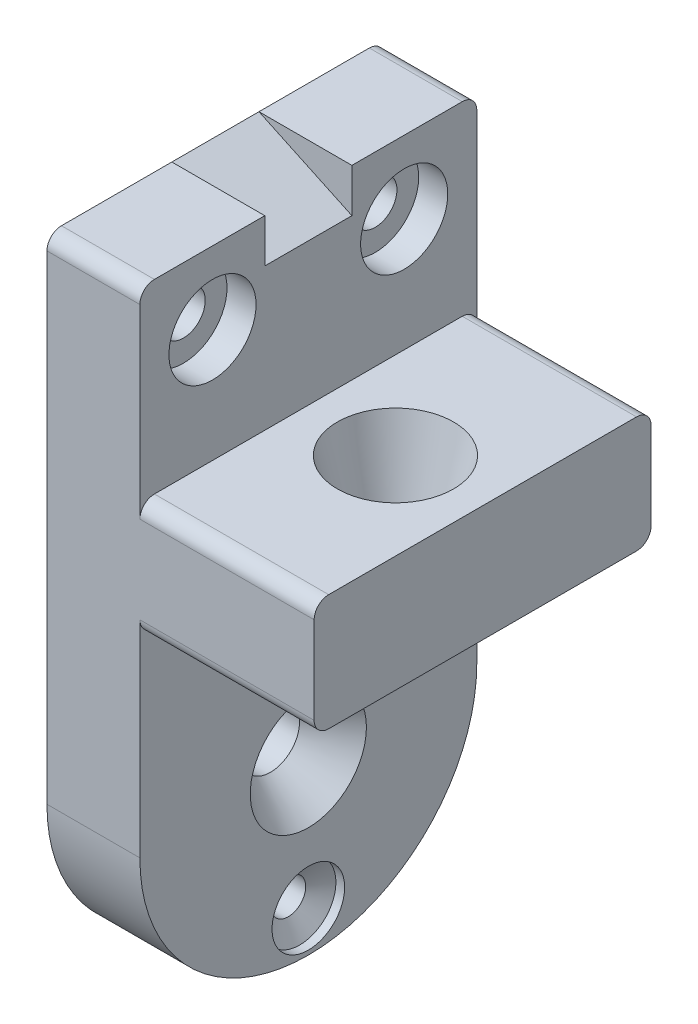
ISO-10303-21;
HEADER;
FILE_DESCRIPTION(('STEP AP214'),'2;1');
FILE_NAME('part.step','',(''),(''),'','','');
FILE_SCHEMA(('AUTOMOTIVE_DESIGN { 1 0 10303 214 1 1 1 1 }'));
ENDSEC;
DATA;
#1=APPLICATION_CONTEXT('core data for automotive mechanical design processes');
#2=APPLICATION_PROTOCOL_DEFINITION('international standard','automotive_design',2000,#1);
#3=PRODUCT_CONTEXT('',#1,'mechanical');
#4=PRODUCT('Part','Part','',(#3));
#5=PRODUCT_RELATED_PRODUCT_CATEGORY('part','',(#4));
#6=PRODUCT_DEFINITION_FORMATION('','',#4);
#7=PRODUCT_DEFINITION_CONTEXT('part definition',#1,'design');
#8=PRODUCT_DEFINITION('design','',#6,#7);
#9=PRODUCT_DEFINITION_SHAPE('','',#8);
#10=(LENGTH_UNIT() NAMED_UNIT(*) SI_UNIT(.MILLI.,.METRE.));
#11=(NAMED_UNIT(*) PLANE_ANGLE_UNIT() SI_UNIT($,.RADIAN.));
#12=(NAMED_UNIT(*) SI_UNIT($,.STERADIAN.) SOLID_ANGLE_UNIT());
#13=UNCERTAINTY_MEASURE_WITH_UNIT(LENGTH_MEASURE(1.E-05),#10,'distance_accuracy_value','');
#14=(GEOMETRIC_REPRESENTATION_CONTEXT(3) GLOBAL_UNCERTAINTY_ASSIGNED_CONTEXT((#13)) GLOBAL_UNIT_ASSIGNED_CONTEXT((#10,
#11,#12)) REPRESENTATION_CONTEXT('',''));
#15=CARTESIAN_POINT('',(0.,0.,0.));
#16=DIRECTION('',(0.,0.,1.));
#17=DIRECTION('',(1.,0.,0.));
#18=AXIS2_PLACEMENT_3D('',#15,#16,#17);
#19=CARTESIAN_POINT('',(0.,228.,-116.));
#20=DIRECTION('',(0.,1.,0.));
#21=DIRECTION('',(0.,0.,1.));
#22=AXIS2_PLACEMENT_3D('',#19,#20,#21);
#23=PLANE('',#22);
#24=DIRECTION('',(0.,0.,1.));
#25=VECTOR('',#24,1.);
#26=CARTESIAN_POINT('',(-32.,228.,-116.));
#27=LINE('',#26,#25);
#28=CARTESIAN_POINT('',(-32.,228.,-111.));
#29=VERTEX_POINT('',#28);
#30=CARTESIAN_POINT('',(-32.,228.,-73.));
#31=VERTEX_POINT('',#30);
#32=EDGE_CURVE('E277',#29,#31,#27,.T.);
#33=ORIENTED_EDGE('',*,*,#32,.T.);
#34=DIRECTION('',(-1.,0.,0.));
#35=VECTOR('',#34,1.);
#36=CARTESIAN_POINT('',(-32.,228.,-73.));
#37=LINE('',#36,#35);
#38=CARTESIAN_POINT('',(0.,228.,-73.));
#39=VERTEX_POINT('',#38);
#40=EDGE_CURVE('E184',#39,#31,#37,.T.);
#41=ORIENTED_EDGE('',*,*,#40,.F.);
#42=DIRECTION('',(0.,0.,1.));
#43=VECTOR('',#42,1.);
#44=CARTESIAN_POINT('',(0.,228.,-116.));
#45=LINE('',#44,#43);
#46=CARTESIAN_POINT('',(0.,228.,-111.));
#47=VERTEX_POINT('',#46);
#48=EDGE_CURVE('E195',#47,#39,#45,.T.);
#49=ORIENTED_EDGE('',*,*,#48,.F.);
#50=DIRECTION('',(-1.,0.,0.));
#51=VECTOR('',#50,1.);
#52=CARTESIAN_POINT('',(0.,228.,-111.));
#53=LINE('',#52,#51);
#54=EDGE_CURVE('E331',#47,#29,#53,.T.);
#55=ORIENTED_EDGE('',*,*,#54,.T.);
#56=EDGE_LOOP('',(#33,#41,#49,#55));
#57=FACE_BOUND('',#56,.T.);
#58=ADVANCED_FACE('F45',(#57),#23,.T.);
#59=CARTESIAN_POINT('',(0.,164.,-116.));
#60=DIRECTION('',(1.,0.,0.));
#61=DIRECTION('',(0.,1.,0.));
#62=AXIS2_PLACEMENT_3D('',#59,#60,#61);
#63=PLANE('',#62);
#64=CARTESIAN_POINT('',(0.,203.,-25.));
#65=DIRECTION('',(1.,0.,0.));
#66=DIRECTION('',(0.,0.,-1.));
#67=AXIS2_PLACEMENT_3D('',#64,#65,#66);
#68=CIRCLE('',#67,15.);
#69=CARTESIAN_POINT('',(0.,203.,-40.));
#70=VERTEX_POINT('',#69);
#71=EDGE_CURVE('E231',#70,#70,#68,.T.);
#72=ORIENTED_EDGE('',*,*,#71,.F.);
#73=EDGE_LOOP('',(#72));
#74=FACE_BOUND('',#73,.T.);
#75=CARTESIAN_POINT('',(0.,203.,-91.));
#76=DIRECTION('',(1.,0.,0.));
#77=DIRECTION('',(0.,0.,-1.));
#78=AXIS2_PLACEMENT_3D('',#75,#76,#77);
#79=CIRCLE('',#78,15.);
#80=CARTESIAN_POINT('',(0.,203.,-106.));
#81=VERTEX_POINT('',#80);
#82=EDGE_CURVE('E243',#81,#81,#79,.T.);
#83=ORIENTED_EDGE('',*,*,#82,.F.);
#84=EDGE_LOOP('',(#83));
#85=FACE_BOUND('',#84,.T.);
#86=ORIENTED_EDGE('',*,*,#48,.T.);
#87=DIRECTION('',(0.,1.,0.));
#88=VECTOR('',#87,1.);
#89=CARTESIAN_POINT('',(0.,228.,-73.));
#90=LINE('',#89,#88);
#91=CARTESIAN_POINT('',(0.,213.,-73.));
#92=VERTEX_POINT('',#91);
#93=EDGE_CURVE('E188',#92,#39,#90,.T.);
#94=ORIENTED_EDGE('',*,*,#93,.F.);
#95=DIRECTION('',(0.,0.,1.));
#96=VECTOR('',#95,1.);
#97=CARTESIAN_POINT('',(0.,213.,-73.));
#98=LINE('',#97,#96);
#99=CARTESIAN_POINT('',(0.,213.,-43.));
#100=VERTEX_POINT('',#99);
#101=EDGE_CURVE('E175',#92,#100,#98,.T.);
#102=ORIENTED_EDGE('',*,*,#101,.T.);
#103=DIRECTION('',(0.,1.,0.));
#104=VECTOR('',#103,1.);
#105=CARTESIAN_POINT('',(0.,228.,-43.));
#106=LINE('',#105,#104);
#107=CARTESIAN_POINT('',(0.,228.,-43.));
#108=VERTEX_POINT('',#107);
#109=EDGE_CURVE('E200',#100,#108,#106,.T.);
#110=ORIENTED_EDGE('',*,*,#109,.T.);
#111=CARTESIAN_POINT('',(0.,228.,-5.00000000000003));
#112=VERTEX_POINT('',#111);
#113=EDGE_CURVE('E283',#108,#112,#45,.T.);
#114=ORIENTED_EDGE('',*,*,#113,.T.);
#115=CARTESIAN_POINT('',(0.,223.,-5.));
#116=DIRECTION('',(1.,0.,0.));
#117=DIRECTION('',(0.,1.,0.));
#118=AXIS2_PLACEMENT_3D('',#115,#116,#117);
#119=CIRCLE('',#118,5.);
#120=CARTESIAN_POINT('',(0.,223.,0.));
#121=VERTEX_POINT('',#120);
#122=EDGE_CURVE('E339',#112,#121,#119,.T.);
#123=ORIENTED_EDGE('',*,*,#122,.T.);
#124=DIRECTION('',(0.,1.,0.));
#125=VECTOR('',#124,1.);
#126=CARTESIAN_POINT('',(0.,164.,0.));
#127=LINE('',#126,#125);
#128=CARTESIAN_POINT('',(0.,159.,0.));
#129=VERTEX_POINT('',#128);
#130=EDGE_CURVE('E273',#129,#121,#127,.T.);
#131=ORIENTED_EDGE('',*,*,#130,.F.);
#132=CARTESIAN_POINT('',(0.,159.,-5.));
#133=DIRECTION('',(1.,0.,0.));
#134=DIRECTION('',(0.,1.,0.));
#135=AXIS2_PLACEMENT_3D('',#132,#133,#134);
#136=CIRCLE('',#135,5.);
#137=CARTESIAN_POINT('',(0.,164.,-5.00000000000003));
#138=VERTEX_POINT('',#137);
#139=EDGE_CURVE('E348',#129,#138,#136,.F.);
#140=ORIENTED_EDGE('',*,*,#139,.T.);
#141=DIRECTION('',(0.,0.,1.));
#142=VECTOR('',#141,1.);
#143=CARTESIAN_POINT('',(0.,164.,-116.));
#144=LINE('',#143,#142);
#145=CARTESIAN_POINT('',(0.,164.,-111.));
#146=VERTEX_POINT('',#145);
#147=EDGE_CURVE('E284',#146,#138,#144,.T.);
#148=ORIENTED_EDGE('',*,*,#147,.F.);
#149=CARTESIAN_POINT('',(0.,159.,-111.));
#150=DIRECTION('',(1.,0.,0.));
#151=DIRECTION('',(0.,1.,0.));
#152=AXIS2_PLACEMENT_3D('',#149,#150,#151);
#153=CIRCLE('',#152,5.);
#154=CARTESIAN_POINT('',(0.,159.,-116.));
#155=VERTEX_POINT('',#154);
#156=EDGE_CURVE('E350',#146,#155,#153,.F.);
#157=ORIENTED_EDGE('',*,*,#156,.T.);
#158=DIRECTION('',(0.,1.,0.));
#159=VECTOR('',#158,1.);
#160=CARTESIAN_POINT('',(0.,164.,-116.));
#161=LINE('',#160,#159);
#162=CARTESIAN_POINT('',(0.,223.,-116.));
#163=VERTEX_POINT('',#162);
#164=EDGE_CURVE('E261',#155,#163,#161,.T.);
#165=ORIENTED_EDGE('',*,*,#164,.T.);
#166=CARTESIAN_POINT('',(0.,223.,-111.));
#167=DIRECTION('',(1.,0.,0.));
#168=DIRECTION('',(0.,1.,0.));
#169=AXIS2_PLACEMENT_3D('',#166,#167,#168);
#170=CIRCLE('',#169,5.);
#171=EDGE_CURVE('E341',#163,#47,#170,.T.);
#172=ORIENTED_EDGE('',*,*,#171,.T.);
#173=EDGE_LOOP('',(#86,#94,#102,#110,#114,#123,#131,#140,#148,#157,#165,#172));
#174=FACE_BOUND('',#173,.T.);
#175=ADVANCED_FACE('F193',(#74,#85,#174),#63,.T.);
#176=CARTESIAN_POINT('',(0.,0.,-116.));
#177=DIRECTION('',(1.,0.,0.));
#178=DIRECTION('',(0.,0.,-1.));
#179=AXIS2_PLACEMENT_3D('',#176,#177,#178);
#180=PLANE('',#179);
#181=CARTESIAN_POINT('',(0.,14.,-58.));
#182=DIRECTION('',(1.,0.,0.));
#183=DIRECTION('',(0.,0.,-1.));
#184=AXIS2_PLACEMENT_3D('',#181,#182,#183);
#185=CIRCLE('',#184,12.5);
#186=CARTESIAN_POINT('',(0.,14.,-70.5));
#187=VERTEX_POINT('',#186);
#188=EDGE_CURVE('E210',#187,#187,#185,.T.);
#189=ORIENTED_EDGE('',*,*,#188,.F.);
#190=EDGE_LOOP('',(#189));
#191=FACE_BOUND('',#190,.T.);
#192=CARTESIAN_POINT('',(0.,58.,-58.));
#193=DIRECTION('',(1.,0.,0.));
#194=DIRECTION('',(0.,0.,-1.));
#195=AXIS2_PLACEMENT_3D('',#192,#193,#194);
#196=CIRCLE('',#195,20.);
#197=CARTESIAN_POINT('',(0.,58.,-78.));
#198=VERTEX_POINT('',#197);
#199=EDGE_CURVE('E222',#198,#198,#196,.T.);
#200=ORIENTED_EDGE('',*,*,#199,.F.);
#201=EDGE_LOOP('',(#200));
#202=FACE_BOUND('',#201,.T.);
#203=CARTESIAN_POINT('',(0.,58.,-58.));
#204=DIRECTION('',(1.,0.,0.));
#205=DIRECTION('',(0.,0.,-1.));
#206=AXIS2_PLACEMENT_3D('',#203,#204,#205);
#207=CIRCLE('',#206,58.);
#208=CARTESIAN_POINT('',(0.,58.,0.));
#209=VERTEX_POINT('',#208);
#210=CARTESIAN_POINT('',(0.,0.,-58.));
#211=VERTEX_POINT('',#210);
#212=EDGE_CURVE('E353',#209,#211,#207,.T.);
#213=ORIENTED_EDGE('',*,*,#212,.T.);
#214=CARTESIAN_POINT('',(0.,58.,-58.));
#215=DIRECTION('',(1.,0.,0.));
#216=DIRECTION('',(0.,0.,-1.));
#217=AXIS2_PLACEMENT_3D('',#214,#215,#216);
#218=CIRCLE('',#217,58.);
#219=CARTESIAN_POINT('',(0.,58.,-116.));
#220=VERTEX_POINT('',#219);
#221=EDGE_CURVE('E355',#211,#220,#218,.T.);
#222=ORIENTED_EDGE('',*,*,#221,.T.);
#223=DIRECTION('',(0.,1.,0.));
#224=VECTOR('',#223,1.);
#225=CARTESIAN_POINT('',(0.,0.,-116.));
#226=LINE('',#225,#224);
#227=CARTESIAN_POINT('',(0.,129.,-116.));
#228=VERTEX_POINT('',#227);
#229=EDGE_CURVE('E255',#220,#228,#226,.T.);
#230=ORIENTED_EDGE('',*,*,#229,.T.);
#231=CARTESIAN_POINT('',(0.,129.,-111.));
#232=DIRECTION('',(1.,0.,0.));
#233=DIRECTION('',(0.,0.,-1.));
#234=AXIS2_PLACEMENT_3D('',#231,#232,#233);
#235=CIRCLE('',#234,5.);
#236=CARTESIAN_POINT('',(0.,124.,-111.));
#237=VERTEX_POINT('',#236);
#238=EDGE_CURVE('E343',#228,#237,#235,.F.);
#239=ORIENTED_EDGE('',*,*,#238,.T.);
#240=DIRECTION('',(0.,0.,1.));
#241=VECTOR('',#240,1.);
#242=CARTESIAN_POINT('',(0.,124.,-116.));
#243=LINE('',#242,#241);
#244=CARTESIAN_POINT('',(0.,124.,-5.00000000000003));
#245=VERTEX_POINT('',#244);
#246=EDGE_CURVE('E267',#237,#245,#243,.T.);
#247=ORIENTED_EDGE('',*,*,#246,.T.);
#248=CARTESIAN_POINT('',(0.,129.,-5.));
#249=DIRECTION('',(1.,0.,0.));
#250=DIRECTION('',(0.,0.,-1.));
#251=AXIS2_PLACEMENT_3D('',#248,#249,#250);
#252=CIRCLE('',#251,5.);
#253=CARTESIAN_POINT('',(0.,129.,0.));
#254=VERTEX_POINT('',#253);
#255=EDGE_CURVE('E345',#245,#254,#252,.F.);
#256=ORIENTED_EDGE('',*,*,#255,.T.);
#257=DIRECTION('',(0.,1.,0.));
#258=VECTOR('',#257,1.);
#259=CARTESIAN_POINT('',(0.,0.,0.));
#260=LINE('',#259,#258);
#261=EDGE_CURVE('E268',#209,#254,#260,.T.);
#262=ORIENTED_EDGE('',*,*,#261,.F.);
#263=EDGE_LOOP('',(#213,#222,#230,#239,#247,#256,#262));
#264=FACE_BOUND('',#263,.T.);
#265=ADVANCED_FACE('F374',(#191,#202,#264),#180,.T.);
#266=CARTESIAN_POINT('',(-32.,0.,-116.));
#267=DIRECTION('',(-1.,0.,0.));
#268=DIRECTION('',(0.,0.,1.));
#269=AXIS2_PLACEMENT_3D('',#266,#267,#268);
#270=PLANE('',#269);
#271=CARTESIAN_POINT('',(-32.,58.,-58.));
#272=DIRECTION('',(1.,0.,0.));
#273=DIRECTION('',(0.,0.,-1.));
#274=AXIS2_PLACEMENT_3D('',#271,#272,#273);
#275=CIRCLE('',#274,10.);
#276=CARTESIAN_POINT('',(-32.,58.,-68.));
#277=VERTEX_POINT('',#276);
#278=EDGE_CURVE('E228',#277,#277,#275,.T.);
#279=ORIENTED_EDGE('',*,*,#278,.T.);
#280=EDGE_LOOP('',(#279));
#281=FACE_BOUND('',#280,.T.);
#282=CARTESIAN_POINT('',(-32.,203.,-25.));
#283=DIRECTION('',(1.,0.,0.));
#284=DIRECTION('',(0.,0.,-1.));
#285=AXIS2_PLACEMENT_3D('',#282,#283,#284);
#286=CIRCLE('',#285,7.49999999999998);
#287=CARTESIAN_POINT('',(-32.,203.,-32.5));
#288=VERTEX_POINT('',#287);
#289=EDGE_CURVE('E240',#288,#288,#286,.T.);
#290=ORIENTED_EDGE('',*,*,#289,.T.);
#291=EDGE_LOOP('',(#290));
#292=FACE_BOUND('',#291,.T.);
#293=CARTESIAN_POINT('',(-32.,203.,-91.));
#294=DIRECTION('',(1.,0.,0.));
#295=DIRECTION('',(0.,0.,-1.));
#296=AXIS2_PLACEMENT_3D('',#293,#294,#295);
#297=CIRCLE('',#296,7.49999999999998);
#298=CARTESIAN_POINT('',(-32.,203.,-98.5));
#299=VERTEX_POINT('',#298);
#300=EDGE_CURVE('E252',#299,#299,#297,.T.);
#301=ORIENTED_EDGE('',*,*,#300,.T.);
#302=EDGE_LOOP('',(#301));
#303=FACE_BOUND('',#302,.T.);
#304=DIRECTION('',(0.,-1.,0.));
#305=VECTOR('',#304,1.);
#306=CARTESIAN_POINT('',(-32.,0.,-116.));
#307=LINE('',#306,#305);
#308=CARTESIAN_POINT('',(-32.,223.,-116.));
#309=VERTEX_POINT('',#308);
#310=CARTESIAN_POINT('',(-32.,58.,-116.));
#311=VERTEX_POINT('',#310);
#312=EDGE_CURVE('E264',#309,#311,#307,.T.);
#313=ORIENTED_EDGE('',*,*,#312,.T.);
#314=CARTESIAN_POINT('',(-32.,58.,-58.));
#315=DIRECTION('',(-1.,0.,0.));
#316=DIRECTION('',(0.,0.,1.));
#317=AXIS2_PLACEMENT_3D('',#314,#315,#316);
#318=CIRCLE('',#317,58.);
#319=CARTESIAN_POINT('',(-32.,0.,-58.));
#320=VERTEX_POINT('',#319);
#321=EDGE_CURVE('E54',#311,#320,#318,.T.);
#322=ORIENTED_EDGE('',*,*,#321,.T.);
#323=CARTESIAN_POINT('',(-32.,58.,-58.));
#324=DIRECTION('',(-1.,0.,0.));
#325=DIRECTION('',(0.,0.,1.));
#326=AXIS2_PLACEMENT_3D('',#323,#324,#325);
#327=CIRCLE('',#326,58.);
#328=CARTESIAN_POINT('',(-32.,58.,0.));
#329=VERTEX_POINT('',#328);
#330=EDGE_CURVE('E69',#320,#329,#327,.T.);
#331=ORIENTED_EDGE('',*,*,#330,.T.);
#332=DIRECTION('',(0.,-1.,0.));
#333=VECTOR('',#332,1.);
#334=CARTESIAN_POINT('',(-32.,0.,0.));
#335=LINE('',#334,#333);
#336=CARTESIAN_POINT('',(-32.,223.,0.));
#337=VERTEX_POINT('',#336);
#338=EDGE_CURVE('E258',#337,#329,#335,.T.);
#339=ORIENTED_EDGE('',*,*,#338,.F.);
#340=CARTESIAN_POINT('',(-32.,223.,-5.));
#341=DIRECTION('',(-1.,0.,0.));
#342=DIRECTION('',(0.,0.,1.));
#343=AXIS2_PLACEMENT_3D('',#340,#341,#342);
#344=CIRCLE('',#343,5.);
#345=CARTESIAN_POINT('',(-32.,228.,-5.00000000000003));
#346=VERTEX_POINT('',#345);
#347=EDGE_CURVE('E334',#337,#346,#344,.T.);
#348=ORIENTED_EDGE('',*,*,#347,.T.);
#349=CARTESIAN_POINT('',(-32.,228.,-43.));
#350=VERTEX_POINT('',#349);
#351=EDGE_CURVE('E281',#350,#346,#27,.T.);
#352=ORIENTED_EDGE('',*,*,#351,.F.);
#353=DIRECTION('',(0.,0.,1.));
#354=VECTOR('',#353,1.);
#355=CARTESIAN_POINT('',(-32.,228.,-73.));
#356=LINE('',#355,#354);
#357=EDGE_CURVE('E183',#31,#350,#356,.T.);
#358=ORIENTED_EDGE('',*,*,#357,.F.);
#359=ORIENTED_EDGE('',*,*,#32,.F.);
#360=CARTESIAN_POINT('',(-32.,223.,-111.));
#361=DIRECTION('',(-1.,0.,0.));
#362=DIRECTION('',(0.,0.,1.));
#363=AXIS2_PLACEMENT_3D('',#360,#361,#362);
#364=CIRCLE('',#363,5.);
#365=EDGE_CURVE('E337',#29,#309,#364,.T.);
#366=ORIENTED_EDGE('',*,*,#365,.T.);
#367=EDGE_LOOP('',(#313,#322,#331,#339,#348,#352,#358,#359,#366));
#368=FACE_BOUND('',#367,.T.);
#369=ADVANCED_FACE('F361',(#281,#292,#303,#368),#270,.T.);
#370=DIRECTION('',(-1.,0.,0.));
#371=VECTOR('',#370,1.);
#372=CARTESIAN_POINT('',(-32.,228.,-43.));
#373=LINE('',#372,#371);
#374=EDGE_CURVE('E61',#108,#350,#373,.T.);
#375=ORIENTED_EDGE('',*,*,#374,.T.);
#376=ORIENTED_EDGE('',*,*,#351,.T.);
#377=DIRECTION('',(-1.,0.,0.));
#378=VECTOR('',#377,1.);
#379=CARTESIAN_POINT('',(0.,228.,-5.));
#380=LINE('',#379,#378);
#381=EDGE_CURVE('E328',#346,#112,#380,.F.);
#382=ORIENTED_EDGE('',*,*,#381,.T.);
#383=ORIENTED_EDGE('',*,*,#113,.F.);
#384=EDGE_LOOP('',(#375,#376,#382,#383));
#385=FACE_BOUND('',#384,.T.);
#386=ADVANCED_FACE('F404',(#385),#23,.T.);
#387=CARTESIAN_POINT('',(0.,164.,-116.));
#388=DIRECTION('',(0.,1.,0.));
#389=DIRECTION('',(0.,0.,1.));
#390=AXIS2_PLACEMENT_3D('',#387,#388,#389);
#391=PLANE('',#390);
#392=CARTESIAN_POINT('',(30.,164.,-58.));
#393=DIRECTION('',(0.,1.,0.));
#394=DIRECTION('',(0.,0.,1.));
#395=AXIS2_PLACEMENT_3D('',#392,#393,#394);
#396=CIRCLE('',#395,20.);
#397=CARTESIAN_POINT('',(30.,164.,-38.));
#398=VERTEX_POINT('',#397);
#399=EDGE_CURVE('E203',#398,#398,#396,.T.);
#400=ORIENTED_EDGE('',*,*,#399,.F.);
#401=EDGE_LOOP('',(#400));
#402=FACE_BOUND('',#401,.T.);
#403=ORIENTED_EDGE('',*,*,#147,.T.);
#404=DIRECTION('',(-1.,0.,0.));
#405=VECTOR('',#404,1.);
#406=CARTESIAN_POINT('',(60.,164.,-5.));
#407=LINE('',#406,#405);
#408=CARTESIAN_POINT('',(60.,164.,-5.00000000000003));
#409=VERTEX_POINT('',#408);
#410=EDGE_CURVE('E326',#138,#409,#407,.F.);
#411=ORIENTED_EDGE('',*,*,#410,.T.);
#412=DIRECTION('',(0.,0.,1.));
#413=VECTOR('',#412,1.);
#414=CARTESIAN_POINT('',(60.,164.,-116.));
#415=LINE('',#414,#413);
#416=CARTESIAN_POINT('',(60.,164.,-111.));
#417=VERTEX_POINT('',#416);
#418=EDGE_CURVE('E287',#417,#409,#415,.T.);
#419=ORIENTED_EDGE('',*,*,#418,.F.);
#420=DIRECTION('',(-1.,0.,0.));
#421=VECTOR('',#420,1.);
#422=CARTESIAN_POINT('',(0.,164.,-111.));
#423=LINE('',#422,#421);
#424=EDGE_CURVE('E323',#417,#146,#423,.T.);
#425=ORIENTED_EDGE('',*,*,#424,.T.);
#426=EDGE_LOOP('',(#403,#411,#419,#425));
#427=FACE_BOUND('',#426,.T.);
#428=ADVANCED_FACE('F424',(#402,#427),#391,.T.);
#429=CARTESIAN_POINT('',(60.,164.,-116.));
#430=DIRECTION('',(1.,0.,0.));
#431=DIRECTION('',(0.,0.,-1.));
#432=AXIS2_PLACEMENT_3D('',#429,#430,#431);
#433=PLANE('',#432);
#434=DIRECTION('',(0.,0.,1.));
#435=VECTOR('',#434,1.);
#436=CARTESIAN_POINT('',(60.,124.,-116.));
#437=LINE('',#436,#435);
#438=CARTESIAN_POINT('',(60.,124.,-111.));
#439=VERTEX_POINT('',#438);
#440=CARTESIAN_POINT('',(60.,124.,-5.00000000000003));
#441=VERTEX_POINT('',#440);
#442=EDGE_CURVE('E290',#439,#441,#437,.T.);
#443=ORIENTED_EDGE('',*,*,#442,.F.);
#444=CARTESIAN_POINT('',(60.,129.,-111.));
#445=DIRECTION('',(1.,0.,0.));
#446=DIRECTION('',(0.,0.,-1.));
#447=AXIS2_PLACEMENT_3D('',#444,#445,#446);
#448=CIRCLE('',#447,5.);
#449=CARTESIAN_POINT('',(60.,129.,-116.));
#450=VERTEX_POINT('',#449);
#451=EDGE_CURVE('E305',#439,#450,#448,.T.);
#452=ORIENTED_EDGE('',*,*,#451,.T.);
#453=DIRECTION('',(0.,1.,0.));
#454=VECTOR('',#453,1.);
#455=CARTESIAN_POINT('',(60.,164.,-116.));
#456=LINE('',#455,#454);
#457=CARTESIAN_POINT('',(60.,159.,-116.));
#458=VERTEX_POINT('',#457);
#459=EDGE_CURVE('E257',#450,#458,#456,.T.);
#460=ORIENTED_EDGE('',*,*,#459,.T.);
#461=CARTESIAN_POINT('',(60.,159.,-111.));
#462=DIRECTION('',(1.,0.,0.));
#463=DIRECTION('',(0.,0.,-1.));
#464=AXIS2_PLACEMENT_3D('',#461,#462,#463);
#465=CIRCLE('',#464,5.);
#466=EDGE_CURVE('E299',#458,#417,#465,.T.);
#467=ORIENTED_EDGE('',*,*,#466,.T.);
#468=ORIENTED_EDGE('',*,*,#418,.T.);
#469=CARTESIAN_POINT('',(60.,159.,-5.));
#470=DIRECTION('',(1.,0.,0.));
#471=DIRECTION('',(0.,0.,-1.));
#472=AXIS2_PLACEMENT_3D('',#469,#470,#471);
#473=CIRCLE('',#472,5.);
#474=CARTESIAN_POINT('',(60.,159.,0.));
#475=VERTEX_POINT('',#474);
#476=EDGE_CURVE('E301',#409,#475,#473,.T.);
#477=ORIENTED_EDGE('',*,*,#476,.T.);
#478=DIRECTION('',(0.,1.,0.));
#479=VECTOR('',#478,1.);
#480=CARTESIAN_POINT('',(60.,164.,0.));
#481=LINE('',#480,#479);
#482=CARTESIAN_POINT('',(60.,129.,0.));
#483=VERTEX_POINT('',#482);
#484=EDGE_CURVE('E270',#483,#475,#481,.T.);
#485=ORIENTED_EDGE('',*,*,#484,.F.);
#486=CARTESIAN_POINT('',(60.,129.,-5.));
#487=DIRECTION('',(1.,0.,0.));
#488=DIRECTION('',(0.,0.,-1.));
#489=AXIS2_PLACEMENT_3D('',#486,#487,#488);
#490=CIRCLE('',#489,5.);
#491=EDGE_CURVE('E303',#483,#441,#490,.T.);
#492=ORIENTED_EDGE('',*,*,#491,.T.);
#493=EDGE_LOOP('',(#443,#452,#460,#467,#468,#477,#485,#492));
#494=FACE_BOUND('',#493,.T.);
#495=ADVANCED_FACE('F430',(#494),#433,.T.);
#496=CARTESIAN_POINT('',(0.,124.,-116.));
#497=DIRECTION('',(0.,-1.,0.));
#498=DIRECTION('',(0.,0.,-1.));
#499=AXIS2_PLACEMENT_3D('',#496,#497,#498);
#500=PLANE('',#499);
#501=CARTESIAN_POINT('',(30.,124.,-58.));
#502=DIRECTION('',(0.,1.,0.));
#503=DIRECTION('',(0.,0.,1.));
#504=AXIS2_PLACEMENT_3D('',#501,#502,#503);
#505=CIRCLE('',#504,10.);
#506=CARTESIAN_POINT('',(30.,124.,-48.));
#507=VERTEX_POINT('',#506);
#508=EDGE_CURVE('E207',#507,#507,#505,.T.);
#509=ORIENTED_EDGE('',*,*,#508,.T.);
#510=EDGE_LOOP('',(#509));
#511=FACE_BOUND('',#510,.T.);
#512=ORIENTED_EDGE('',*,*,#246,.F.);
#513=DIRECTION('',(1.,0.,0.));
#514=VECTOR('',#513,1.);
#515=CARTESIAN_POINT('',(0.,124.,-111.));
#516=LINE('',#515,#514);
#517=EDGE_CURVE('E296',#237,#439,#516,.T.);
#518=ORIENTED_EDGE('',*,*,#517,.T.);
#519=ORIENTED_EDGE('',*,*,#442,.T.);
#520=DIRECTION('',(1.,0.,0.));
#521=VECTOR('',#520,1.);
#522=CARTESIAN_POINT('',(0.,124.,-5.));
#523=LINE('',#522,#521);
#524=EDGE_CURVE('E280',#441,#245,#523,.F.);
#525=ORIENTED_EDGE('',*,*,#524,.T.);
#526=EDGE_LOOP('',(#512,#518,#519,#525));
#527=FACE_BOUND('',#526,.T.);
#528=ADVANCED_FACE('F387',(#511,#527),#500,.T.);
#529=CARTESIAN_POINT('',(0.,0.,-116.));
#530=DIRECTION('',(0.,0.,-1.));
#531=DIRECTION('',(-1.,0.,0.));
#532=AXIS2_PLACEMENT_3D('',#529,#530,#531);
#533=PLANE('',#532);
#534=ORIENTED_EDGE('',*,*,#229,.F.);
#535=DIRECTION('',(1.,0.,0.));
#536=VECTOR('',#535,1.);
#537=CARTESIAN_POINT('',(0.,58.,-116.));
#538=LINE('',#537,#536);
#539=EDGE_CURVE('E357',#220,#311,#538,.F.);
#540=ORIENTED_EDGE('',*,*,#539,.T.);
#541=ORIENTED_EDGE('',*,*,#312,.F.);
#542=DIRECTION('',(-1.,0.,0.));
#543=VECTOR('',#542,1.);
#544=CARTESIAN_POINT('',(0.,223.,-116.));
#545=LINE('',#544,#543);
#546=EDGE_CURVE('E307',#309,#163,#545,.F.);
#547=ORIENTED_EDGE('',*,*,#546,.T.);
#548=ORIENTED_EDGE('',*,*,#164,.F.);
#549=DIRECTION('',(-1.,0.,0.));
#550=VECTOR('',#549,1.);
#551=CARTESIAN_POINT('',(0.,159.,-116.));
#552=LINE('',#551,#550);
#553=EDGE_CURVE('E309',#155,#458,#552,.F.);
#554=ORIENTED_EDGE('',*,*,#553,.T.);
#555=ORIENTED_EDGE('',*,*,#459,.F.);
#556=DIRECTION('',(1.,0.,0.));
#557=VECTOR('',#556,1.);
#558=CARTESIAN_POINT('',(0.,129.,-116.));
#559=LINE('',#558,#557);
#560=EDGE_CURVE('E311',#450,#228,#559,.F.);
#561=ORIENTED_EDGE('',*,*,#560,.T.);
#562=EDGE_LOOP('',(#534,#540,#541,#547,#548,#554,#555,#561));
#563=FACE_BOUND('',#562,.T.);
#564=ADVANCED_FACE('F377',(#563),#533,.T.);
#565=CARTESIAN_POINT('',(0.,0.,0.));
#566=DIRECTION('',(0.,0.,-1.));
#567=DIRECTION('',(-1.,0.,0.));
#568=AXIS2_PLACEMENT_3D('',#565,#566,#567);
#569=PLANE('',#568);
#570=ORIENTED_EDGE('',*,*,#338,.T.);
#571=DIRECTION('',(1.,0.,0.));
#572=VECTOR('',#571,1.);
#573=CARTESIAN_POINT('',(0.,58.,0.));
#574=LINE('',#573,#572);
#575=EDGE_CURVE('E11',#329,#209,#574,.T.);
#576=ORIENTED_EDGE('',*,*,#575,.T.);
#577=ORIENTED_EDGE('',*,*,#261,.T.);
#578=DIRECTION('',(1.,0.,0.));
#579=VECTOR('',#578,1.);
#580=CARTESIAN_POINT('',(60.,129.,0.));
#581=LINE('',#580,#579);
#582=EDGE_CURVE('E320',#254,#483,#581,.T.);
#583=ORIENTED_EDGE('',*,*,#582,.T.);
#584=ORIENTED_EDGE('',*,*,#484,.T.);
#585=DIRECTION('',(-1.,0.,0.));
#586=VECTOR('',#585,1.);
#587=CARTESIAN_POINT('',(0.,159.,0.));
#588=LINE('',#587,#586);
#589=EDGE_CURVE('E317',#475,#129,#588,.T.);
#590=ORIENTED_EDGE('',*,*,#589,.T.);
#591=ORIENTED_EDGE('',*,*,#130,.T.);
#592=DIRECTION('',(-1.,0.,0.));
#593=VECTOR('',#592,1.);
#594=CARTESIAN_POINT('',(-32.,223.,0.));
#595=LINE('',#594,#593);
#596=EDGE_CURVE('E314',#121,#337,#595,.T.);
#597=ORIENTED_EDGE('',*,*,#596,.T.);
#598=EDGE_LOOP('',(#570,#576,#577,#583,#584,#590,#591,#597));
#599=FACE_BOUND('',#598,.T.);
#600=ADVANCED_FACE('F394',(#599),#569,.F.);
#601=CARTESIAN_POINT('',(0.,129.,-111.));
#602=DIRECTION('',(1.,0.,0.));
#603=DIRECTION('',(0.,0.,-1.));
#604=AXIS2_PLACEMENT_3D('',#601,#602,#603);
#605=CYLINDRICAL_SURFACE('',#604,5.);
#606=ORIENTED_EDGE('',*,*,#238,.F.);
#607=ORIENTED_EDGE('',*,*,#560,.F.);
#608=ORIENTED_EDGE('',*,*,#451,.F.);
#609=ORIENTED_EDGE('',*,*,#517,.F.);
#610=EDGE_LOOP('',(#606,#607,#608,#609));
#611=FACE_BOUND('',#610,.T.);
#612=ADVANCED_FACE('F383',(#611),#605,.T.);
#613=CARTESIAN_POINT('',(0.,129.,-5.));
#614=DIRECTION('',(-1.,0.,0.));
#615=DIRECTION('',(0.,0.,1.));
#616=AXIS2_PLACEMENT_3D('',#613,#614,#615);
#617=CYLINDRICAL_SURFACE('',#616,5.);
#618=ORIENTED_EDGE('',*,*,#255,.F.);
#619=ORIENTED_EDGE('',*,*,#524,.F.);
#620=ORIENTED_EDGE('',*,*,#491,.F.);
#621=ORIENTED_EDGE('',*,*,#582,.F.);
#622=EDGE_LOOP('',(#618,#619,#620,#621));
#623=FACE_BOUND('',#622,.T.);
#624=ADVANCED_FACE('F391',(#623),#617,.T.);
#625=CARTESIAN_POINT('',(0.,159.,-5.));
#626=DIRECTION('',(1.,0.,0.));
#627=DIRECTION('',(0.,0.,-1.));
#628=AXIS2_PLACEMENT_3D('',#625,#626,#627);
#629=CYLINDRICAL_SURFACE('',#628,5.);
#630=ORIENTED_EDGE('',*,*,#476,.F.);
#631=ORIENTED_EDGE('',*,*,#410,.F.);
#632=ORIENTED_EDGE('',*,*,#139,.F.);
#633=ORIENTED_EDGE('',*,*,#589,.F.);
#634=EDGE_LOOP('',(#630,#631,#632,#633));
#635=FACE_BOUND('',#634,.T.);
#636=ADVANCED_FACE('F594',(#635),#629,.T.);
#637=CARTESIAN_POINT('',(0.,159.,-111.));
#638=DIRECTION('',(-1.,0.,0.));
#639=DIRECTION('',(0.,0.,1.));
#640=AXIS2_PLACEMENT_3D('',#637,#638,#639);
#641=CYLINDRICAL_SURFACE('',#640,5.);
#642=ORIENTED_EDGE('',*,*,#466,.F.);
#643=ORIENTED_EDGE('',*,*,#553,.F.);
#644=ORIENTED_EDGE('',*,*,#156,.F.);
#645=ORIENTED_EDGE('',*,*,#424,.F.);
#646=EDGE_LOOP('',(#642,#643,#644,#645));
#647=FACE_BOUND('',#646,.T.);
#648=ADVANCED_FACE('F586',(#647),#641,.T.);
#649=CARTESIAN_POINT('',(0.,223.,-111.));
#650=DIRECTION('',(-1.,0.,0.));
#651=DIRECTION('',(0.,0.,1.));
#652=AXIS2_PLACEMENT_3D('',#649,#650,#651);
#653=CYLINDRICAL_SURFACE('',#652,5.);
#654=ORIENTED_EDGE('',*,*,#171,.F.);
#655=ORIENTED_EDGE('',*,*,#546,.F.);
#656=ORIENTED_EDGE('',*,*,#365,.F.);
#657=ORIENTED_EDGE('',*,*,#54,.F.);
#658=EDGE_LOOP('',(#654,#655,#656,#657));
#659=FACE_BOUND('',#658,.T.);
#660=ADVANCED_FACE('F579',(#659),#653,.T.);
#661=CARTESIAN_POINT('',(0.,223.,-5.));
#662=DIRECTION('',(1.,0.,0.));
#663=DIRECTION('',(0.,0.,-1.));
#664=AXIS2_PLACEMENT_3D('',#661,#662,#663);
#665=CYLINDRICAL_SURFACE('',#664,5.);
#666=ORIENTED_EDGE('',*,*,#122,.F.);
#667=ORIENTED_EDGE('',*,*,#381,.F.);
#668=ORIENTED_EDGE('',*,*,#347,.F.);
#669=ORIENTED_EDGE('',*,*,#596,.F.);
#670=EDGE_LOOP('',(#666,#667,#668,#669));
#671=FACE_BOUND('',#670,.T.);
#672=ADVANCED_FACE('F401',(#671),#665,.T.);
#673=CARTESIAN_POINT('',(0.,58.,-58.));
#674=DIRECTION('',(-1.,0.,0.));
#675=DIRECTION('',(0.,0.,1.));
#676=AXIS2_PLACEMENT_3D('',#673,#674,#675);
#677=CYLINDRICAL_SURFACE('',#676,58.);
#678=ORIENTED_EDGE('',*,*,#575,.F.);
#679=ORIENTED_EDGE('',*,*,#330,.F.);
#680=DIRECTION('',(1.,0.,0.));
#681=VECTOR('',#680,1.);
#682=CARTESIAN_POINT('',(-32.,0.,-58.));
#683=LINE('',#682,#681);
#684=EDGE_CURVE('E49',#211,#320,#683,.F.);
#685=ORIENTED_EDGE('',*,*,#684,.F.);
#686=ORIENTED_EDGE('',*,*,#212,.F.);
#687=EDGE_LOOP('',(#678,#679,#685,#686));
#688=FACE_BOUND('',#687,.T.);
#689=ADVANCED_FACE('F47',(#688),#677,.T.);
#690=CARTESIAN_POINT('',(0.,58.,-58.));
#691=DIRECTION('',(1.,0.,0.));
#692=DIRECTION('',(0.,0.,-1.));
#693=AXIS2_PLACEMENT_3D('',#690,#691,#692);
#694=CYLINDRICAL_SURFACE('',#693,58.);
#695=ORIENTED_EDGE('',*,*,#321,.F.);
#696=ORIENTED_EDGE('',*,*,#539,.F.);
#697=ORIENTED_EDGE('',*,*,#221,.F.);
#698=ORIENTED_EDGE('',*,*,#684,.T.);
#699=EDGE_LOOP('',(#695,#696,#697,#698));
#700=FACE_BOUND('',#699,.T.);
#701=ADVANCED_FACE('F371',(#700),#694,.T.);
#702=CARTESIAN_POINT('',(0.,203.,-91.));
#703=DIRECTION('',(1.,0.,0.));
#704=DIRECTION('',(0.,0.,-1.));
#705=AXIS2_PLACEMENT_3D('',#702,#703,#704);
#706=CYLINDRICAL_SURFACE('',#705,7.49999999999999);
#707=ORIENTED_EDGE('',*,*,#300,.F.);
#708=EDGE_LOOP('',(#707));
#709=FACE_BOUND('',#708,.T.);
#710=CARTESIAN_POINT('',(-10.,203.,-91.));
#711=DIRECTION('',(1.,0.,0.));
#712=DIRECTION('',(0.,0.,-1.));
#713=AXIS2_PLACEMENT_3D('',#710,#711,#712);
#714=CIRCLE('',#713,7.50000000000001);
#715=CARTESIAN_POINT('',(-10.,203.,-98.5));
#716=VERTEX_POINT('',#715);
#717=EDGE_CURVE('E249',#716,#716,#714,.T.);
#718=ORIENTED_EDGE('',*,*,#717,.T.);
#719=EDGE_LOOP('',(#718));
#720=FACE_BOUND('',#719,.T.);
#721=ADVANCED_FACE('F445',(#709,#720),#706,.F.);
#722=CARTESIAN_POINT('',(-10.,210.5,-91.));
#723=DIRECTION('',(-1.,0.,0.));
#724=DIRECTION('',(0.,0.,1.));
#725=AXIS2_PLACEMENT_3D('',#722,#723,#724);
#726=PLANE('',#725);
#727=ORIENTED_EDGE('',*,*,#717,.F.);
#728=EDGE_LOOP('',(#727));
#729=FACE_BOUND('',#728,.T.);
#730=CARTESIAN_POINT('',(-10.,203.,-91.));
#731=DIRECTION('',(1.,0.,0.));
#732=DIRECTION('',(0.,0.,-1.));
#733=AXIS2_PLACEMENT_3D('',#730,#731,#732);
#734=CIRCLE('',#733,15.);
#735=CARTESIAN_POINT('',(-10.,203.,-106.));
#736=VERTEX_POINT('',#735);
#737=EDGE_CURVE('E246',#736,#736,#734,.T.);
#738=ORIENTED_EDGE('',*,*,#737,.T.);
#739=EDGE_LOOP('',(#738));
#740=FACE_BOUND('',#739,.T.);
#741=ADVANCED_FACE('F448',(#729,#740),#726,.F.);
#742=CARTESIAN_POINT('',(0.,203.,-91.));
#743=DIRECTION('',(1.,0.,0.));
#744=DIRECTION('',(0.,0.,-1.));
#745=AXIS2_PLACEMENT_3D('',#742,#743,#744);
#746=CYLINDRICAL_SURFACE('',#745,15.);
#747=ORIENTED_EDGE('',*,*,#737,.F.);
#748=EDGE_LOOP('',(#747));
#749=FACE_BOUND('',#748,.T.);
#750=ORIENTED_EDGE('',*,*,#82,.T.);
#751=EDGE_LOOP('',(#750));
#752=FACE_BOUND('',#751,.T.);
#753=ADVANCED_FACE('F452',(#749,#752),#746,.F.);
#754=CARTESIAN_POINT('',(0.,203.,-25.));
#755=DIRECTION('',(1.,0.,0.));
#756=DIRECTION('',(0.,0.,-1.));
#757=AXIS2_PLACEMENT_3D('',#754,#755,#756);
#758=CYLINDRICAL_SURFACE('',#757,7.49999999999999);
#759=ORIENTED_EDGE('',*,*,#289,.F.);
#760=EDGE_LOOP('',(#759));
#761=FACE_BOUND('',#760,.T.);
#762=CARTESIAN_POINT('',(-10.,203.,-25.));
#763=DIRECTION('',(1.,0.,0.));
#764=DIRECTION('',(0.,0.,-1.));
#765=AXIS2_PLACEMENT_3D('',#762,#763,#764);
#766=CIRCLE('',#765,7.50000000000001);
#767=CARTESIAN_POINT('',(-10.,203.,-32.5));
#768=VERTEX_POINT('',#767);
#769=EDGE_CURVE('E237',#768,#768,#766,.T.);
#770=ORIENTED_EDGE('',*,*,#769,.T.);
#771=EDGE_LOOP('',(#770));
#772=FACE_BOUND('',#771,.T.);
#773=ADVANCED_FACE('F456',(#761,#772),#758,.F.);
#774=CARTESIAN_POINT('',(-10.,210.5,-25.));
#775=DIRECTION('',(-1.,0.,0.));
#776=DIRECTION('',(0.,0.,1.));
#777=AXIS2_PLACEMENT_3D('',#774,#775,#776);
#778=PLANE('',#777);
#779=ORIENTED_EDGE('',*,*,#769,.F.);
#780=EDGE_LOOP('',(#779));
#781=FACE_BOUND('',#780,.T.);
#782=CARTESIAN_POINT('',(-10.,203.,-25.));
#783=DIRECTION('',(1.,0.,0.));
#784=DIRECTION('',(0.,0.,-1.));
#785=AXIS2_PLACEMENT_3D('',#782,#783,#784);
#786=CIRCLE('',#785,15.);
#787=CARTESIAN_POINT('',(-10.,203.,-40.));
#788=VERTEX_POINT('',#787);
#789=EDGE_CURVE('E234',#788,#788,#786,.T.);
#790=ORIENTED_EDGE('',*,*,#789,.T.);
#791=EDGE_LOOP('',(#790));
#792=FACE_BOUND('',#791,.T.);
#793=ADVANCED_FACE('F460',(#781,#792),#778,.F.);
#794=CARTESIAN_POINT('',(0.,203.,-25.));
#795=DIRECTION('',(1.,0.,0.));
#796=DIRECTION('',(0.,0.,-1.));
#797=AXIS2_PLACEMENT_3D('',#794,#795,#796);
#798=CYLINDRICAL_SURFACE('',#797,15.);
#799=ORIENTED_EDGE('',*,*,#789,.F.);
#800=EDGE_LOOP('',(#799));
#801=FACE_BOUND('',#800,.T.);
#802=ORIENTED_EDGE('',*,*,#71,.T.);
#803=EDGE_LOOP('',(#802));
#804=FACE_BOUND('',#803,.T.);
#805=ADVANCED_FACE('F464',(#801,#804),#798,.F.);
#806=CARTESIAN_POINT('',(0.,58.,-58.));
#807=DIRECTION('',(1.,0.,0.));
#808=DIRECTION('',(0.,0.,-1.));
#809=AXIS2_PLACEMENT_3D('',#806,#807,#808);
#810=CYLINDRICAL_SURFACE('',#809,10.);
#811=ORIENTED_EDGE('',*,*,#278,.F.);
#812=EDGE_LOOP('',(#811));
#813=FACE_BOUND('',#812,.T.);
#814=CARTESIAN_POINT('',(-13.0322537284121,58.,-58.));
#815=DIRECTION('',(1.,0.,0.));
#816=DIRECTION('',(0.,0.,-1.));
#817=AXIS2_PLACEMENT_3D('',#814,#815,#816);
#818=CIRCLE('',#817,10.);
#819=CARTESIAN_POINT('',(-13.0322537284121,58.,-68.));
#820=VERTEX_POINT('',#819);
#821=EDGE_CURVE('E225',#820,#820,#818,.T.);
#822=ORIENTED_EDGE('',*,*,#821,.T.);
#823=EDGE_LOOP('',(#822));
#824=FACE_BOUND('',#823,.T.);
#825=ADVANCED_FACE('F468',(#813,#824),#810,.F.);
#826=CARTESIAN_POINT('',(0.,58.,-58.));
#827=DIRECTION('',(1.,0.,0.));
#828=DIRECTION('',(0.,0.,-1.));
#829=AXIS2_PLACEMENT_3D('',#826,#827,#828);
#830=CONICAL_SURFACE('',#829,20.,0.654498469497874);
#831=ORIENTED_EDGE('',*,*,#821,.F.);
#832=EDGE_LOOP('',(#831));
#833=FACE_BOUND('',#832,.T.);
#834=ORIENTED_EDGE('',*,*,#199,.T.);
#835=EDGE_LOOP('',(#834));
#836=FACE_BOUND('',#835,.T.);
#837=ADVANCED_FACE('F472',(#833,#836),#830,.F.);
#838=CARTESIAN_POINT('',(-20.,14.,-58.));
#839=DIRECTION('',(1.,0.,0.));
#840=DIRECTION('',(0.,0.,-1.));
#841=AXIS2_PLACEMENT_3D('',#838,#839,#840);
#842=CONICAL_SURFACE('',#841,6.,0.654498469497875);
#843=CARTESIAN_POINT('',(-27.8193522370472,14.,-58.));
#844=VERTEX_POINT('',#843);
#845=VERTEX_LOOP('',#844);
#846=FACE_BOUND('',#845,.T.);
#847=CARTESIAN_POINT('',(-20.,14.,-58.));
#848=DIRECTION('',(1.,0.,0.));
#849=DIRECTION('',(0.,0.,-1.));
#850=AXIS2_PLACEMENT_3D('',#847,#848,#849);
#851=CIRCLE('',#850,6.);
#852=CARTESIAN_POINT('',(-20.,14.,-64.));
#853=VERTEX_POINT('',#852);
#854=EDGE_CURVE('E219',#853,#853,#851,.T.);
#855=ORIENTED_EDGE('',*,*,#854,.T.);
#856=EDGE_LOOP('',(#855));
#857=FACE_BOUND('',#856,.T.);
#858=ADVANCED_FACE('F476',(#846,#857),#842,.F.);
#859=CARTESIAN_POINT('',(0.,14.,-58.));
#860=DIRECTION('',(1.,0.,0.));
#861=DIRECTION('',(0.,0.,-1.));
#862=AXIS2_PLACEMENT_3D('',#859,#860,#861);
#863=CYLINDRICAL_SURFACE('',#862,6.);
#864=ORIENTED_EDGE('',*,*,#854,.F.);
#865=EDGE_LOOP('',(#864));
#866=FACE_BOUND('',#865,.T.);
#867=CARTESIAN_POINT('',(-6.90559402367912,14.,-58.));
#868=DIRECTION('',(1.,0.,0.));
#869=DIRECTION('',(0.,0.,-1.));
#870=AXIS2_PLACEMENT_3D('',#867,#868,#869);
#871=CIRCLE('',#870,6.);
#872=CARTESIAN_POINT('',(-6.90559402367912,14.,-64.));
#873=VERTEX_POINT('',#872);
#874=EDGE_CURVE('E216',#873,#873,#871,.T.);
#875=ORIENTED_EDGE('',*,*,#874,.T.);
#876=EDGE_LOOP('',(#875));
#877=FACE_BOUND('',#876,.T.);
#878=ADVANCED_FACE('F480',(#866,#877),#863,.F.);
#879=CARTESIAN_POINT('',(-3.,14.,-58.));
#880=DIRECTION('',(1.,0.,0.));
#881=DIRECTION('',(0.,0.,-1.));
#882=AXIS2_PLACEMENT_3D('',#879,#880,#881);
#883=CONICAL_SURFACE('',#882,12.5,1.02974425867666);
#884=ORIENTED_EDGE('',*,*,#874,.F.);
#885=EDGE_LOOP('',(#884));
#886=FACE_BOUND('',#885,.T.);
#887=CARTESIAN_POINT('',(-3.,14.,-58.));
#888=DIRECTION('',(1.,0.,0.));
#889=DIRECTION('',(0.,0.,-1.));
#890=AXIS2_PLACEMENT_3D('',#887,#888,#889);
#891=CIRCLE('',#890,12.5);
#892=CARTESIAN_POINT('',(-3.,14.,-70.5));
#893=VERTEX_POINT('',#892);
#894=EDGE_CURVE('E213',#893,#893,#891,.T.);
#895=ORIENTED_EDGE('',*,*,#894,.T.);
#896=EDGE_LOOP('',(#895));
#897=FACE_BOUND('',#896,.T.);
#898=ADVANCED_FACE('F484',(#886,#897),#883,.F.);
#899=CARTESIAN_POINT('',(0.,14.,-58.));
#900=DIRECTION('',(1.,0.,0.));
#901=DIRECTION('',(0.,0.,-1.));
#902=AXIS2_PLACEMENT_3D('',#899,#900,#901);
#903=CYLINDRICAL_SURFACE('',#902,12.5);
#904=ORIENTED_EDGE('',*,*,#894,.F.);
#905=EDGE_LOOP('',(#904));
#906=FACE_BOUND('',#905,.T.);
#907=ORIENTED_EDGE('',*,*,#188,.T.);
#908=EDGE_LOOP('',(#907));
#909=FACE_BOUND('',#908,.T.);
#910=ADVANCED_FACE('F488',(#906,#909),#903,.F.);
#911=CARTESIAN_POINT('',(30.,164.,-58.));
#912=DIRECTION('',(0.,1.,0.));
#913=DIRECTION('',(0.,0.,1.));
#914=AXIS2_PLACEMENT_3D('',#911,#912,#913);
#915=CONICAL_SURFACE('',#914,20.,0.244978663126864);
#916=ORIENTED_EDGE('',*,*,#508,.F.);
#917=EDGE_LOOP('',(#916));
#918=FACE_BOUND('',#917,.T.);
#919=ORIENTED_EDGE('',*,*,#399,.T.);
#920=EDGE_LOOP('',(#919));
#921=FACE_BOUND('',#920,.T.);
#922=ADVANCED_FACE('F492',(#918,#921),#915,.F.);
#923=CARTESIAN_POINT('',(0.,213.,-73.));
#924=DIRECTION('',(-0.424433876230719,-0.905458935958869,0.));
#925=DIRECTION('',(0.905458935958869,-0.424433876230719,0.));
#926=AXIS2_PLACEMENT_3D('',#923,#924,#925);
#927=PLANE('',#926);
#928=DIRECTION('',(0.905458935958869,-0.424433876230719,0.));
#929=VECTOR('',#928,1.);
#930=CARTESIAN_POINT('',(0.,213.,-43.));
#931=LINE('',#930,#929);
#932=EDGE_CURVE('E180',#350,#100,#931,.T.);
#933=ORIENTED_EDGE('',*,*,#932,.T.);
#934=ORIENTED_EDGE('',*,*,#101,.F.);
#935=DIRECTION('',(0.905458935958869,-0.424433876230719,0.));
#936=VECTOR('',#935,1.);
#937=CARTESIAN_POINT('',(0.,213.,-73.));
#938=LINE('',#937,#936);
#939=EDGE_CURVE('E178',#31,#92,#938,.T.);
#940=ORIENTED_EDGE('',*,*,#939,.F.);
#941=ORIENTED_EDGE('',*,*,#357,.T.);
#942=EDGE_LOOP('',(#933,#934,#940,#941));
#943=FACE_BOUND('',#942,.T.);
#944=ADVANCED_FACE('F177',(#943),#927,.F.);
#945=CARTESIAN_POINT('',(0.,0.,-73.));
#946=DIRECTION('',(0.,0.,1.));
#947=DIRECTION('',(1.,0.,0.));
#948=AXIS2_PLACEMENT_3D('',#945,#946,#947);
#949=PLANE('',#948);
#950=ORIENTED_EDGE('',*,*,#939,.T.);
#951=ORIENTED_EDGE('',*,*,#93,.T.);
#952=ORIENTED_EDGE('',*,*,#40,.T.);
#953=EDGE_LOOP('',(#950,#951,#952));
#954=FACE_BOUND('',#953,.T.);
#955=ADVANCED_FACE('F187',(#954),#949,.T.);
#956=CARTESIAN_POINT('',(0.,0.,-43.));
#957=DIRECTION('',(0.,0.,1.));
#958=DIRECTION('',(1.,0.,0.));
#959=AXIS2_PLACEMENT_3D('',#956,#957,#958);
#960=PLANE('',#959);
#961=ORIENTED_EDGE('',*,*,#932,.F.);
#962=ORIENTED_EDGE('',*,*,#374,.F.);
#963=ORIENTED_EDGE('',*,*,#109,.F.);
#964=EDGE_LOOP('',(#961,#962,#963));
#965=FACE_BOUND('',#964,.T.);
#966=ADVANCED_FACE('F405',(#965),#960,.F.);
#967=CLOSED_SHELL('',(#58,#175,#265,#369,#386,#428,#495,#528,#564,#600,#612,#624,#636,#648,#660,
#672,#689,#701,#721,#741,#753,#773,#793,#805,#825,#837,#858,#878,#898,#910,#922,#944,#955,#966));
#968=MANIFOLD_SOLID_BREP('B2',#967);
#969=ADVANCED_BREP_SHAPE_REPRESENTATION('',(#18,#968),#14);
#970=SHAPE_DEFINITION_REPRESENTATION(#9,#969);
ENDSEC;
END-ISO-10303-21;
